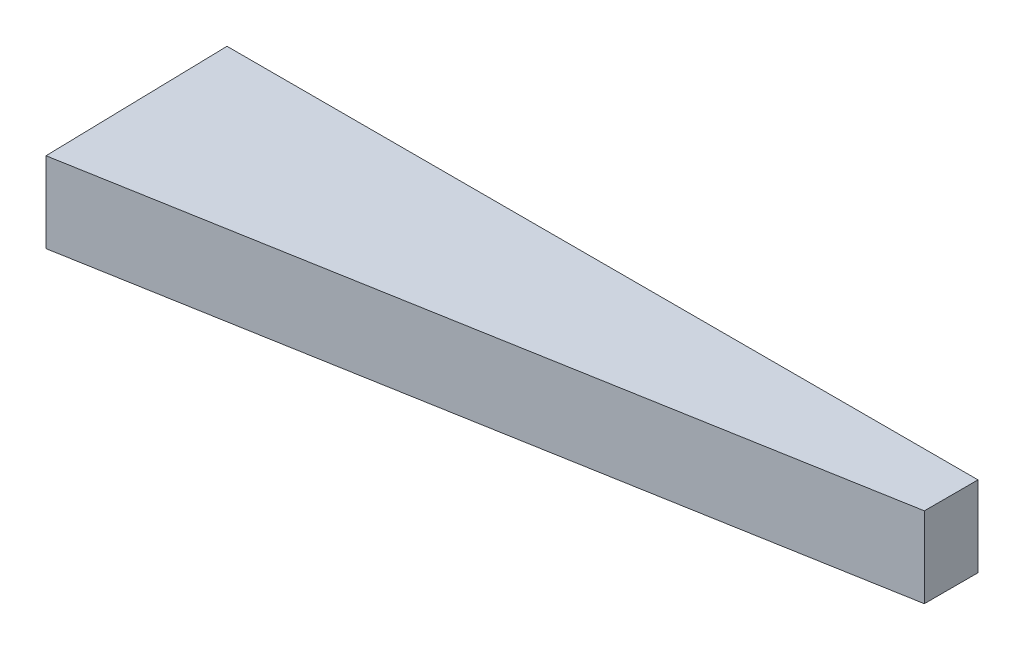
ISO-10303-21;
HEADER;
FILE_DESCRIPTION(('STEP AP214'),'2;1');
FILE_NAME('part.step','',(''),(''),'','','');
FILE_SCHEMA(('AUTOMOTIVE_DESIGN { 1 0 10303 214 1 1 1 1 }'));
ENDSEC;
DATA;
#1=APPLICATION_CONTEXT('core data for automotive mechanical design processes');
#2=APPLICATION_PROTOCOL_DEFINITION('international standard','automotive_design',2000,#1);
#3=PRODUCT_CONTEXT('',#1,'mechanical');
#4=PRODUCT('Part','Part','',(#3));
#5=PRODUCT_RELATED_PRODUCT_CATEGORY('part','',(#4));
#6=PRODUCT_DEFINITION_FORMATION('','',#4);
#7=PRODUCT_DEFINITION_CONTEXT('part definition',#1,'design');
#8=PRODUCT_DEFINITION('design','',#6,#7);
#9=PRODUCT_DEFINITION_SHAPE('','',#8);
#10=(LENGTH_UNIT() NAMED_UNIT(*) SI_UNIT(.MILLI.,.METRE.));
#11=(NAMED_UNIT(*) PLANE_ANGLE_UNIT() SI_UNIT($,.RADIAN.));
#12=(NAMED_UNIT(*) SI_UNIT($,.STERADIAN.) SOLID_ANGLE_UNIT());
#13=UNCERTAINTY_MEASURE_WITH_UNIT(LENGTH_MEASURE(1.E-05),#10,'distance_accuracy_value','');
#14=(GEOMETRIC_REPRESENTATION_CONTEXT(3) GLOBAL_UNCERTAINTY_ASSIGNED_CONTEXT((#13)) GLOBAL_UNIT_ASSIGNED_CONTEXT((#10,
#11,#12)) REPRESENTATION_CONTEXT('',''));
#15=CARTESIAN_POINT('',(0.,0.,0.));
#16=DIRECTION('',(0.,0.,1.));
#17=DIRECTION('',(1.,0.,0.));
#18=AXIS2_PLACEMENT_3D('',#15,#16,#17);
#19=CARTESIAN_POINT('',(0.,19.05,0.));
#20=DIRECTION('',(0.999731446934062,0.,-0.0231739942851168));
#21=DIRECTION('',(-0.0231739942851168,0.,-0.999731446934062));
#22=AXIS2_PLACEMENT_3D('',#19,#20,#21);
#23=PLANE('',#22);
#24=DIRECTION('',(0.0231739942851168,0.,0.999731446934062));
#25=VECTOR('',#24,1.);
#26=CARTESIAN_POINT('',(0.,0.,0.));
#27=LINE('',#26,#25);
#28=CARTESIAN_POINT('',(0.,0.,0.));
#29=VERTEX_POINT('',#28);
#30=CARTESIAN_POINT('',(1.01695379524153,0.,43.8716207777289));
#31=VERTEX_POINT('',#30);
#32=EDGE_CURVE('E105',#29,#31,#27,.T.);
#33=ORIENTED_EDGE('',*,*,#32,.T.);
#34=DIRECTION('',(0.,-1.,0.));
#35=VECTOR('',#34,1.);
#36=CARTESIAN_POINT('',(1.01695379524153,19.05,43.8716207777289));
#37=LINE('',#36,#35);
#38=CARTESIAN_POINT('',(1.01695379524153,19.05,43.8716207777289));
#39=VERTEX_POINT('',#38);
#40=EDGE_CURVE('E11',#39,#31,#37,.T.);
#41=ORIENTED_EDGE('',*,*,#40,.F.);
#42=DIRECTION('',(0.0231739942851168,0.,0.999731446934062));
#43=VECTOR('',#42,1.);
#44=CARTESIAN_POINT('',(0.,19.05,0.));
#45=LINE('',#44,#43);
#46=CARTESIAN_POINT('',(0.,19.05,0.));
#47=VERTEX_POINT('',#46);
#48=EDGE_CURVE('E89',#47,#39,#45,.T.);
#49=ORIENTED_EDGE('',*,*,#48,.F.);
#50=DIRECTION('',(0.,-1.,0.));
#51=VECTOR('',#50,1.);
#52=CARTESIAN_POINT('',(0.,19.05,0.));
#53=LINE('',#52,#51);
#54=EDGE_CURVE('E97',#47,#29,#53,.T.);
#55=ORIENTED_EDGE('',*,*,#54,.T.);
#56=EDGE_LOOP('',(#33,#41,#49,#55));
#57=FACE_BOUND('',#56,.T.);
#58=ADVANCED_FACE('F39',(#57),#23,.F.);
#59=CARTESIAN_POINT('',(177.8,19.05,12.7));
#60=DIRECTION('',(-0.173648177666924,0.,-0.984807753012209));
#61=DIRECTION('',(-0.984807753012209,0.,0.173648177666924));
#62=AXIS2_PLACEMENT_3D('',#59,#60,#61);
#63=PLANE('',#62);
#64=DIRECTION('',(0.984807753012209,0.,-0.173648177666924));
#65=VECTOR('',#64,1.);
#66=CARTESIAN_POINT('',(177.8,0.,12.7));
#67=LINE('',#66,#65);
#68=CARTESIAN_POINT('',(177.8,0.,12.7));
#69=VERTEX_POINT('',#68);
#70=EDGE_CURVE('E92',#31,#69,#67,.T.);
#71=ORIENTED_EDGE('',*,*,#70,.T.);
#72=DIRECTION('',(0.,-1.,0.));
#73=VECTOR('',#72,1.);
#74=CARTESIAN_POINT('',(177.8,19.05,12.7));
#75=LINE('',#74,#73);
#76=CARTESIAN_POINT('',(177.8,19.05,12.7));
#77=VERTEX_POINT('',#76);
#78=EDGE_CURVE('E50',#77,#69,#75,.T.);
#79=ORIENTED_EDGE('',*,*,#78,.F.);
#80=DIRECTION('',(0.984807753012209,0.,-0.173648177666924));
#81=VECTOR('',#80,1.);
#82=CARTESIAN_POINT('',(177.8,19.05,12.7));
#83=LINE('',#82,#81);
#84=EDGE_CURVE('E82',#39,#77,#83,.T.);
#85=ORIENTED_EDGE('',*,*,#84,.F.);
#86=ORIENTED_EDGE('',*,*,#40,.T.);
#87=EDGE_LOOP('',(#71,#79,#85,#86));
#88=FACE_BOUND('',#87,.T.);
#89=ADVANCED_FACE('F93',(#88),#63,.F.);
#90=CARTESIAN_POINT('',(177.8,19.05,0.));
#91=DIRECTION('',(-1.,0.,0.));
#92=DIRECTION('',(0.,0.,1.));
#93=AXIS2_PLACEMENT_3D('',#90,#91,#92);
#94=PLANE('',#93);
#95=DIRECTION('',(0.,0.,-1.));
#96=VECTOR('',#95,1.);
#97=CARTESIAN_POINT('',(177.8,0.,0.));
#98=LINE('',#97,#96);
#99=CARTESIAN_POINT('',(177.8,0.,0.));
#100=VERTEX_POINT('',#99);
#101=EDGE_CURVE('E72',#69,#100,#98,.T.);
#102=ORIENTED_EDGE('',*,*,#101,.T.);
#103=DIRECTION('',(0.,-1.,0.));
#104=VECTOR('',#103,1.);
#105=CARTESIAN_POINT('',(177.8,19.05,0.));
#106=LINE('',#105,#104);
#107=CARTESIAN_POINT('',(177.8,19.05,0.));
#108=VERTEX_POINT('',#107);
#109=EDGE_CURVE('E94',#108,#100,#106,.T.);
#110=ORIENTED_EDGE('',*,*,#109,.F.);
#111=DIRECTION('',(0.,0.,-1.));
#112=VECTOR('',#111,1.);
#113=CARTESIAN_POINT('',(177.8,19.05,0.));
#114=LINE('',#113,#112);
#115=EDGE_CURVE('E88',#77,#108,#114,.T.);
#116=ORIENTED_EDGE('',*,*,#115,.F.);
#117=ORIENTED_EDGE('',*,*,#78,.T.);
#118=EDGE_LOOP('',(#102,#110,#116,#117));
#119=FACE_BOUND('',#118,.T.);
#120=ADVANCED_FACE('F96',(#119),#94,.F.);
#121=CARTESIAN_POINT('',(0.,19.05,0.));
#122=DIRECTION('',(0.,0.,1.));
#123=DIRECTION('',(1.,0.,0.));
#124=AXIS2_PLACEMENT_3D('',#121,#122,#123);
#125=PLANE('',#124);
#126=DIRECTION('',(-1.,0.,0.));
#127=VECTOR('',#126,1.);
#128=CARTESIAN_POINT('',(0.,0.,0.));
#129=LINE('',#128,#127);
#130=EDGE_CURVE('E76',#100,#29,#129,.T.);
#131=ORIENTED_EDGE('',*,*,#130,.T.);
#132=ORIENTED_EDGE('',*,*,#54,.F.);
#133=DIRECTION('',(-1.,0.,0.));
#134=VECTOR('',#133,1.);
#135=CARTESIAN_POINT('',(0.,19.05,0.));
#136=LINE('',#135,#134);
#137=EDGE_CURVE('E54',#108,#47,#136,.T.);
#138=ORIENTED_EDGE('',*,*,#137,.F.);
#139=ORIENTED_EDGE('',*,*,#109,.T.);
#140=EDGE_LOOP('',(#131,#132,#138,#139));
#141=FACE_BOUND('',#140,.T.);
#142=ADVANCED_FACE('F108',(#141),#125,.F.);
#143=CARTESIAN_POINT('',(0.,19.05,0.));
#144=DIRECTION('',(0.,1.,0.));
#145=DIRECTION('',(0.,0.,1.));
#146=AXIS2_PLACEMENT_3D('',#143,#144,#145);
#147=PLANE('',#146);
#148=ORIENTED_EDGE('',*,*,#48,.T.);
#149=ORIENTED_EDGE('',*,*,#84,.T.);
#150=ORIENTED_EDGE('',*,*,#115,.T.);
#151=ORIENTED_EDGE('',*,*,#137,.T.);
#152=EDGE_LOOP('',(#148,#149,#150,#151));
#153=FACE_BOUND('',#152,.T.);
#154=ADVANCED_FACE('F86',(#153),#147,.T.);
#155=CARTESIAN_POINT('',(0.,0.,0.));
#156=DIRECTION('',(0.,1.,0.));
#157=DIRECTION('',(0.,0.,1.));
#158=AXIS2_PLACEMENT_3D('',#155,#156,#157);
#159=PLANE('',#158);
#160=ORIENTED_EDGE('',*,*,#32,.F.);
#161=ORIENTED_EDGE('',*,*,#130,.F.);
#162=ORIENTED_EDGE('',*,*,#101,.F.);
#163=ORIENTED_EDGE('',*,*,#70,.F.);
#164=EDGE_LOOP('',(#160,#161,#162,#163));
#165=FACE_BOUND('',#164,.T.);
#166=ADVANCED_FACE('F115',(#165),#159,.F.);
#167=CLOSED_SHELL('',(#58,#89,#120,#142,#154,#166));
#168=MANIFOLD_SOLID_BREP('B2',#167);
#169=ADVANCED_BREP_SHAPE_REPRESENTATION('',(#18,#168),#14);
#170=SHAPE_DEFINITION_REPRESENTATION(#9,#169);
ENDSEC;
END-ISO-10303-21;
